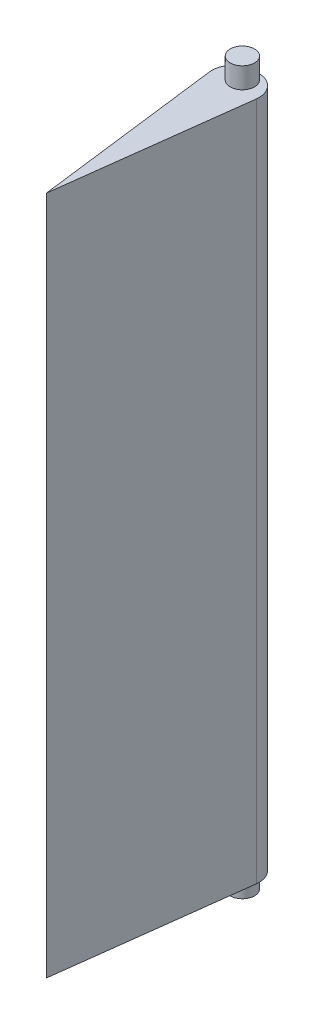
ISO-10303-21;
HEADER;
FILE_DESCRIPTION(('STEP AP214'),'2;1');
FILE_NAME('part.step','',(''),(''),'','','');
FILE_SCHEMA(('AUTOMOTIVE_DESIGN { 1 0 10303 214 1 1 1 1 }'));
ENDSEC;
DATA;
#1=APPLICATION_CONTEXT('core data for automotive mechanical design processes');
#2=APPLICATION_PROTOCOL_DEFINITION('international standard','automotive_design',2000,#1);
#3=PRODUCT_CONTEXT('',#1,'mechanical');
#4=PRODUCT('Part','Part','',(#3));
#5=PRODUCT_RELATED_PRODUCT_CATEGORY('part','',(#4));
#6=PRODUCT_DEFINITION_FORMATION('','',#4);
#7=PRODUCT_DEFINITION_CONTEXT('part definition',#1,'design');
#8=PRODUCT_DEFINITION('design','',#6,#7);
#9=PRODUCT_DEFINITION_SHAPE('','',#8);
#10=(LENGTH_UNIT() NAMED_UNIT(*) SI_UNIT(.MILLI.,.METRE.));
#11=(NAMED_UNIT(*) PLANE_ANGLE_UNIT() SI_UNIT($,.RADIAN.));
#12=(NAMED_UNIT(*) SI_UNIT($,.STERADIAN.) SOLID_ANGLE_UNIT());
#13=UNCERTAINTY_MEASURE_WITH_UNIT(LENGTH_MEASURE(1.E-05),#10,'distance_accuracy_value','');
#14=(GEOMETRIC_REPRESENTATION_CONTEXT(3) GLOBAL_UNCERTAINTY_ASSIGNED_CONTEXT((#13)) GLOBAL_UNIT_ASSIGNED_CONTEXT((#10,
#11,#12)) REPRESENTATION_CONTEXT('',''));
#15=CARTESIAN_POINT('',(0.,0.,0.));
#16=DIRECTION('',(0.,0.,1.));
#17=DIRECTION('',(1.,0.,0.));
#18=AXIS2_PLACEMENT_3D('',#15,#16,#17);
#19=CARTESIAN_POINT('',(0.,248.920000000001,0.));
#20=DIRECTION('',(0.992201999487507,0.,-0.12464025117529));
#21=DIRECTION('',(-0.12464025117529,0.,-0.992201999487507));
#22=AXIS2_PLACEMENT_3D('',#19,#20,#21);
#23=PLANE('',#22);
#24=DIRECTION('',(0.12464025117529,0.,0.992201999487507));
#25=VECTOR('',#24,1.);
#26=CARTESIAN_POINT('',(0.,248.920000000001,0.));
#27=LINE('',#26,#25);
#28=CARTESIAN_POINT('',(1.07653167315808,248.920000000001,8.56975871395546));
#29=VERTEX_POINT('',#28);
#30=CARTESIAN_POINT('',(9.65199999999999,248.920000000001,76.8350000000002));
#31=VERTEX_POINT('',#30);
#32=EDGE_CURVE('E94',#29,#31,#27,.T.);
#33=ORIENTED_EDGE('',*,*,#32,.F.);
#34=DIRECTION('',(0.,-1.,0.));
#35=VECTOR('',#34,1.);
#36=CARTESIAN_POINT('',(1.07653167315808,248.920000000001,8.56975871395546));
#37=LINE('',#36,#35);
#38=CARTESIAN_POINT('',(1.07653167315852,0.,8.56975871395546));
#39=VERTEX_POINT('',#38);
#40=EDGE_CURVE('E113',#29,#39,#37,.T.);
#41=ORIENTED_EDGE('',*,*,#40,.T.);
#42=DIRECTION('',(0.12464025117529,0.,0.992201999487507));
#43=VECTOR('',#42,1.);
#44=CARTESIAN_POINT('',(0.,0.,0.));
#45=LINE('',#44,#43);
#46=CARTESIAN_POINT('',(9.65200000000044,0.,76.8350000000004));
#47=VERTEX_POINT('',#46);
#48=EDGE_CURVE('E112',#39,#47,#45,.T.);
#49=ORIENTED_EDGE('',*,*,#48,.T.);
#50=DIRECTION('',(0.,-1.,0.));
#51=VECTOR('',#50,1.);
#52=CARTESIAN_POINT('',(9.65199999999999,248.920000000001,76.8350000000002));
#53=LINE('',#52,#51);
#54=EDGE_CURVE('E108',#31,#47,#53,.T.);
#55=ORIENTED_EDGE('',*,*,#54,.F.);
#56=EDGE_LOOP('',(#33,#41,#49,#55));
#57=FACE_BOUND('',#56,.T.);
#58=ADVANCED_FACE('F46',(#57),#23,.F.);
#59=CARTESIAN_POINT('',(9.65199999999999,248.920000000001,76.8350000000002));
#60=DIRECTION('',(-0.992201999487507,0.,-0.12464025117529));
#61=DIRECTION('',(-0.12464025117529,0.,0.992201999487507));
#62=AXIS2_PLACEMENT_3D('',#59,#60,#61);
#63=PLANE('',#62);
#64=DIRECTION('',(0.12464025117529,0.,-0.992201999487507));
#65=VECTOR('',#64,1.);
#66=CARTESIAN_POINT('',(9.65200000000044,0.,76.8350000000004));
#67=LINE('',#66,#65);
#68=CARTESIAN_POINT('',(18.2274683268424,0.,8.56975871395535));
#69=VERTEX_POINT('',#68);
#70=EDGE_CURVE('E187',#47,#69,#67,.T.);
#71=ORIENTED_EDGE('',*,*,#70,.T.);
#72=DIRECTION('',(0.,-1.,0.));
#73=VECTOR('',#72,1.);
#74=CARTESIAN_POINT('',(18.227468326842,248.920000000001,8.56975871395543));
#75=LINE('',#74,#73);
#76=CARTESIAN_POINT('',(18.227468326842,248.920000000001,8.56975871395546));
#77=VERTEX_POINT('',#76);
#78=EDGE_CURVE('E61',#69,#77,#75,.F.);
#79=ORIENTED_EDGE('',*,*,#78,.T.);
#80=DIRECTION('',(0.12464025117529,0.,-0.992201999487507));
#81=VECTOR('',#80,1.);
#82=CARTESIAN_POINT('',(9.65199999999999,248.920000000001,76.8350000000002));
#83=LINE('',#82,#81);
#84=EDGE_CURVE('E96',#31,#77,#83,.T.);
#85=ORIENTED_EDGE('',*,*,#84,.F.);
#86=ORIENTED_EDGE('',*,*,#54,.T.);
#87=EDGE_LOOP('',(#71,#79,#85,#86));
#88=FACE_BOUND('',#87,.T.);
#89=ADVANCED_FACE('F107',(#88),#63,.F.);
#90=CARTESIAN_POINT('',(0.,248.920000000001,0.));
#91=DIRECTION('',(0.,0.,1.00000000000002));
#92=DIRECTION('',(1.00000000000002,0.,0.));
#93=AXIS2_PLACEMENT_3D('',#90,#91,#92);
#94=PLANE('',#93);
#95=DIRECTION('',(-1.00000000000002,0.,0.));
#96=VECTOR('',#95,1.);
#97=CARTESIAN_POINT('',(0.,248.920000000001,0.));
#98=LINE('',#97,#96);
#99=CARTESIAN_POINT('',(10.6668890907482,248.920000000001,-2.22044604925031E-13));
#100=VERTEX_POINT('',#99);
#101=CARTESIAN_POINT('',(8.63711090925176,248.920000000001,-8.04911692853238E-13));
#102=VERTEX_POINT('',#101);
#103=EDGE_CURVE('E109',#100,#102,#98,.T.);
#104=ORIENTED_EDGE('',*,*,#103,.F.);
#105=DIRECTION('',(0.,-1.,0.));
#106=VECTOR('',#105,1.);
#107=CARTESIAN_POINT('',(10.6668890907482,248.920000000001,-2.22044604925031E-13));
#108=LINE('',#107,#106);
#109=CARTESIAN_POINT('',(10.6668890907479,0.,-1.19348975147204E-12));
#110=VERTEX_POINT('',#109);
#111=EDGE_CURVE('E127',#100,#110,#108,.T.);
#112=ORIENTED_EDGE('',*,*,#111,.T.);
#113=DIRECTION('',(-1.00000000000002,0.,0.));
#114=VECTOR('',#113,1.);
#115=CARTESIAN_POINT('',(0.,0.,0.));
#116=LINE('',#115,#114);
#117=CARTESIAN_POINT('',(8.6371109092514,0.,-1.16573417585641E-12));
#118=VERTEX_POINT('',#117);
#119=EDGE_CURVE('E104',#110,#118,#116,.T.);
#120=ORIENTED_EDGE('',*,*,#119,.T.);
#121=DIRECTION('',(0.,-1.,0.));
#122=VECTOR('',#121,1.);
#123=CARTESIAN_POINT('',(8.63711090925176,248.920000000001,-8.04911692853238E-13));
#124=LINE('',#123,#122);
#125=EDGE_CURVE('E123',#118,#102,#124,.F.);
#126=ORIENTED_EDGE('',*,*,#125,.T.);
#127=EDGE_LOOP('',(#104,#112,#120,#126));
#128=FACE_BOUND('',#127,.T.);
#129=ADVANCED_FACE('F135',(#128),#94,.F.);
#130=CARTESIAN_POINT('',(0.,248.920000000001,0.));
#131=DIRECTION('',(0.,1.,0.));
#132=DIRECTION('',(0.,0.,1.00000000000002));
#133=AXIS2_PLACEMENT_3D('',#130,#131,#132);
#134=PLANE('',#133);
#135=CARTESIAN_POINT('',(9.65199999999991,248.920000000001,5.08000000000211));
#136=DIRECTION('',(0.,1.,0.));
#137=DIRECTION('',(0.,0.,1.00000000000002));
#138=AXIS2_PLACEMENT_3D('',#135,#136,#137);
#139=CIRCLE('',#138,4.445);
#140=CARTESIAN_POINT('',(9.65199999999997,248.920000000001,0.635000000002028));
#141=VERTEX_POINT('',#140);
#142=EDGE_CURVE('E180',#141,#141,#139,.T.);
#143=ORIENTED_EDGE('',*,*,#142,.F.);
#144=EDGE_LOOP('',(#143));
#145=FACE_BOUND('',#144,.T.);
#146=ORIENTED_EDGE('',*,*,#84,.T.);
#147=CARTESIAN_POINT('',(10.6668890907478,248.920000000001,7.62000000000204));
#148=DIRECTION('',(0.,1.,0.));
#149=DIRECTION('',(0.,0.,1.00000000000002));
#150=AXIS2_PLACEMENT_3D('',#147,#148,#149);
#151=CIRCLE('',#150,7.62);
#152=EDGE_CURVE('E54',#77,#100,#151,.T.);
#153=ORIENTED_EDGE('',*,*,#152,.T.);
#154=ORIENTED_EDGE('',*,*,#103,.T.);
#155=CARTESIAN_POINT('',(8.63711090925218,248.920000000001,7.62000000000154));
#156=DIRECTION('',(0.,1.,0.));
#157=DIRECTION('',(0.,0.,1.00000000000002));
#158=AXIS2_PLACEMENT_3D('',#155,#156,#157);
#159=CIRCLE('',#158,7.62);
#160=EDGE_CURVE('E99',#102,#29,#159,.T.);
#161=ORIENTED_EDGE('',*,*,#160,.T.);
#162=ORIENTED_EDGE('',*,*,#32,.T.);
#163=EDGE_LOOP('',(#146,#153,#154,#161,#162));
#164=FACE_BOUND('',#163,.T.);
#165=ADVANCED_FACE('F95',(#145,#164),#134,.T.);
#166=CARTESIAN_POINT('',(0.,0.,0.));
#167=DIRECTION('',(0.,1.,0.));
#168=DIRECTION('',(0.,0.,1.00000000000002));
#169=AXIS2_PLACEMENT_3D('',#166,#167,#168);
#170=PLANE('',#169);
#171=CARTESIAN_POINT('',(9.65200000000041,0.,5.07999999999978));
#172=DIRECTION('',(0.,1.,0.));
#173=DIRECTION('',(0.,0.,1.00000000000002));
#174=AXIS2_PLACEMENT_3D('',#171,#172,#173);
#175=CIRCLE('',#174,4.445);
#176=CARTESIAN_POINT('',(9.65200000000041,0.,9.52499999999986));
#177=VERTEX_POINT('',#176);
#178=EDGE_CURVE('E13',#177,#177,#175,.F.);
#179=ORIENTED_EDGE('',*,*,#178,.F.);
#180=EDGE_LOOP('',(#179));
#181=FACE_BOUND('',#180,.T.);
#182=ORIENTED_EDGE('',*,*,#119,.F.);
#183=CARTESIAN_POINT('',(10.6668890907473,0.,7.62000000000096));
#184=DIRECTION('',(0.,1.,0.));
#185=DIRECTION('',(0.,0.,1.00000000000002));
#186=AXIS2_PLACEMENT_3D('',#183,#184,#185);
#187=CIRCLE('',#186,7.62);
#188=EDGE_CURVE('E69',#110,#69,#187,.F.);
#189=ORIENTED_EDGE('',*,*,#188,.T.);
#190=ORIENTED_EDGE('',*,*,#70,.F.);
#191=ORIENTED_EDGE('',*,*,#48,.F.);
#192=CARTESIAN_POINT('',(8.63711090925245,0.,7.62000000000093));
#193=DIRECTION('',(0.,1.,0.));
#194=DIRECTION('',(0.,0.,1.00000000000002));
#195=AXIS2_PLACEMENT_3D('',#192,#193,#194);
#196=CIRCLE('',#195,7.62);
#197=EDGE_CURVE('E115',#39,#118,#196,.F.);
#198=ORIENTED_EDGE('',*,*,#197,.T.);
#199=EDGE_LOOP('',(#182,#189,#190,#191,#198));
#200=FACE_BOUND('',#199,.T.);
#201=ADVANCED_FACE('F147',(#181,#200),#170,.F.);
#202=CARTESIAN_POINT('',(8.63711090925218,248.920000000001,7.62000000000154));
#203=DIRECTION('',(0.,-1.,0.));
#204=DIRECTION('',(0.,0.,-1.00000000000002));
#205=AXIS2_PLACEMENT_3D('',#202,#203,#204);
#206=CYLINDRICAL_SURFACE('',#205,7.62);
#207=ORIENTED_EDGE('',*,*,#160,.F.);
#208=ORIENTED_EDGE('',*,*,#125,.F.);
#209=ORIENTED_EDGE('',*,*,#197,.F.);
#210=ORIENTED_EDGE('',*,*,#40,.F.);
#211=EDGE_LOOP('',(#207,#208,#209,#210));
#212=FACE_BOUND('',#211,.T.);
#213=ADVANCED_FACE('F139',(#212),#206,.T.);
#214=CARTESIAN_POINT('',(10.6668890907478,248.920000000001,7.62000000000204));
#215=DIRECTION('',(0.,-1.,0.));
#216=DIRECTION('',(0.,0.,-1.00000000000002));
#217=AXIS2_PLACEMENT_3D('',#214,#215,#216);
#218=CYLINDRICAL_SURFACE('',#217,7.62);
#219=ORIENTED_EDGE('',*,*,#152,.F.);
#220=ORIENTED_EDGE('',*,*,#78,.F.);
#221=ORIENTED_EDGE('',*,*,#188,.F.);
#222=ORIENTED_EDGE('',*,*,#111,.F.);
#223=EDGE_LOOP('',(#219,#220,#221,#222));
#224=FACE_BOUND('',#223,.T.);
#225=ADVANCED_FACE('F48',(#224),#218,.T.);
#226=CARTESIAN_POINT('',(9.65200000000041,-7.61999999999996,5.07999999999978));
#227=DIRECTION('',(0.,1.,0.));
#228=DIRECTION('',(0.,0.,1.00000000000002));
#229=AXIS2_PLACEMENT_3D('',#226,#227,#228);
#230=CYLINDRICAL_SURFACE('',#229,4.445);
#231=CARTESIAN_POINT('',(9.65200000000041,-7.61999999999996,5.07999999999978));
#232=DIRECTION('',(0.,-1.,0.));
#233=DIRECTION('',(0.,0.,-1.00000000000002));
#234=AXIS2_PLACEMENT_3D('',#231,#232,#233);
#235=CIRCLE('',#234,4.445);
#236=CARTESIAN_POINT('',(9.65200000000041,-7.61999999999996,9.52499999999986));
#237=VERTEX_POINT('',#236);
#238=EDGE_CURVE('E179',#237,#237,#235,.T.);
#239=CARTESIAN_POINT('',(9.65200000000041,-7.61999999999996,9.52499999999986));
#240=CARTESIAN_POINT('',(9.65200000000041,-7.54062499999996,9.52499999999986));
#241=CARTESIAN_POINT('',(9.65200000000041,-7.46124999999996,9.52499999999986));
#242=CARTESIAN_POINT('',(9.65200000000041,-7.30249999999996,9.52499999999986));
#243=CARTESIAN_POINT('',(9.65200000000041,-7.22312499999996,9.52499999999986));
#244=CARTESIAN_POINT('',(9.65200000000041,-7.06437499999996,9.52499999999986));
#245=CARTESIAN_POINT('',(9.65200000000041,-6.98499999999996,9.52499999999986));
#246=CARTESIAN_POINT('',(9.65200000000041,-6.82624999999996,9.52499999999986));
#247=CARTESIAN_POINT('',(9.65200000000041,-6.74687499999996,9.52499999999986));
#248=CARTESIAN_POINT('',(9.65200000000041,-6.58812499999997,9.52499999999986));
#249=CARTESIAN_POINT('',(9.65200000000041,-6.50874999999997,9.52499999999986));
#250=CARTESIAN_POINT('',(9.65200000000041,-6.34999999999997,9.52499999999986));
#251=CARTESIAN_POINT('',(9.65200000000041,-6.27062499999997,9.52499999999986));
#252=CARTESIAN_POINT('',(9.65200000000041,-6.11187499999997,9.52499999999986));
#253=CARTESIAN_POINT('',(9.65200000000041,-6.03249999999997,9.52499999999986));
#254=CARTESIAN_POINT('',(9.65200000000041,-5.87374999999997,9.52499999999986));
#255=CARTESIAN_POINT('',(9.65200000000041,-5.79437499999997,9.52499999999986));
#256=CARTESIAN_POINT('',(9.65200000000041,-5.63562499999997,9.52499999999986));
#257=CARTESIAN_POINT('',(9.65200000000041,-5.55624999999997,9.52499999999986));
#258=CARTESIAN_POINT('',(9.65200000000041,-5.39749999999997,9.52499999999986));
#259=CARTESIAN_POINT('',(9.65200000000041,-5.31812499999997,9.52499999999986));
#260=CARTESIAN_POINT('',(9.65200000000041,-5.15937499999997,9.52499999999986));
#261=CARTESIAN_POINT('',(9.65200000000041,-5.07999999999997,9.52499999999986));
#262=CARTESIAN_POINT('',(9.65200000000041,-4.92124999999997,9.52499999999986));
#263=CARTESIAN_POINT('',(9.65200000000041,-4.84187499999998,9.52499999999986));
#264=CARTESIAN_POINT('',(9.65200000000041,-4.68312499999998,9.52499999999986));
#265=CARTESIAN_POINT('',(9.65200000000041,-4.60374999999998,9.52499999999986));
#266=CARTESIAN_POINT('',(9.65200000000041,-4.44499999999998,9.52499999999986));
#267=CARTESIAN_POINT('',(9.65200000000041,-4.36562499999998,9.52499999999986));
#268=CARTESIAN_POINT('',(9.65200000000041,-4.20687499999998,9.52499999999986));
#269=CARTESIAN_POINT('',(9.65200000000041,-4.12749999999998,9.52499999999986));
#270=CARTESIAN_POINT('',(9.65200000000041,-3.96874999999998,9.52499999999986));
#271=CARTESIAN_POINT('',(9.65200000000041,-3.88937499999998,9.52499999999986));
#272=CARTESIAN_POINT('',(9.65200000000041,-3.73062499999998,9.52499999999986));
#273=CARTESIAN_POINT('',(9.65200000000041,-3.65124999999998,9.52499999999986));
#274=CARTESIAN_POINT('',(9.65200000000041,-3.49249999999998,9.52499999999986));
#275=CARTESIAN_POINT('',(9.65200000000041,-3.41312499999998,9.52499999999986));
#276=CARTESIAN_POINT('',(9.65200000000041,-3.25437499999998,9.52499999999986));
#277=CARTESIAN_POINT('',(9.65200000000041,-3.17499999999998,9.52499999999986));
#278=CARTESIAN_POINT('',(9.65200000000041,-3.01624999999999,9.52499999999986));
#279=CARTESIAN_POINT('',(9.65200000000041,-2.93687499999999,9.52499999999986));
#280=CARTESIAN_POINT('',(9.65200000000041,-2.77812499999999,9.52499999999986));
#281=CARTESIAN_POINT('',(9.65200000000041,-2.69874999999999,9.52499999999986));
#282=CARTESIAN_POINT('',(9.65200000000041,-2.53999999999999,9.52499999999986));
#283=CARTESIAN_POINT('',(9.65200000000041,-2.46062499999999,9.52499999999986));
#284=CARTESIAN_POINT('',(9.65200000000041,-2.30187499999999,9.52499999999986));
#285=CARTESIAN_POINT('',(9.65200000000041,-2.22249999999999,9.52499999999986));
#286=CARTESIAN_POINT('',(9.65200000000041,-2.06374999999999,9.52499999999986));
#287=CARTESIAN_POINT('',(9.65200000000041,-1.98437499999999,9.52499999999986));
#288=CARTESIAN_POINT('',(9.65200000000041,-1.82562499999999,9.52499999999986));
#289=CARTESIAN_POINT('',(9.65200000000041,-1.74624999999999,9.52499999999986));
#290=CARTESIAN_POINT('',(9.65200000000041,-1.58749999999999,9.52499999999986));
#291=CARTESIAN_POINT('',(9.65200000000041,-1.50812499999999,9.52499999999986));
#292=CARTESIAN_POINT('',(9.65200000000041,-1.34937499999999,9.52499999999986));
#293=CARTESIAN_POINT('',(9.65200000000041,-1.26999999999999,9.52499999999986));
#294=CARTESIAN_POINT('',(9.65200000000041,-1.11124999999999,9.52499999999986));
#295=CARTESIAN_POINT('',(9.65200000000041,-1.031875,9.52499999999986));
#296=CARTESIAN_POINT('',(9.65200000000041,-0.873124999999996,9.52499999999986));
#297=CARTESIAN_POINT('',(9.65200000000041,-0.793749999999997,9.52499999999986));
#298=CARTESIAN_POINT('',(9.65200000000041,-0.634999999999998,9.52499999999986));
#299=CARTESIAN_POINT('',(9.65200000000041,-0.555624999999998,9.52499999999986));
#300=CARTESIAN_POINT('',(9.65200000000041,-0.396874999999999,9.52499999999986));
#301=CARTESIAN_POINT('',(9.65200000000041,-0.317499999999999,9.52499999999986));
#302=CARTESIAN_POINT('',(9.65200000000041,-0.15875,9.52499999999986));
#303=CARTESIAN_POINT('',(9.65200000000041,-0.0793750000000004,9.52499999999986));
#304=CARTESIAN_POINT('',(9.65200000000041,0.,9.52499999999986));
#305=B_SPLINE_CURVE_WITH_KNOTS('',3,(#239,#240,#241,#242,#243,#244,#245,#246,#247,#248,#249,
#250,#251,#252,#253,#254,#255,#256,#257,#258,#259,#260,#261,#262,#263,#264,#265,#266,#267,#268,
#269,#270,#271,#272,#273,#274,#275,#276,#277,#278,#279,#280,#281,#282,#283,#284,#285,#286,#287,
#288,#289,#290,#291,#292,#293,#294,#295,#296,#297,#298,#299,#300,#301,#302,#303,#304),
.UNSPECIFIED.,.F.,.F.,(4,2,2,2,2,2,2,2,2,2,2,2,2,2,2,2,2,2,2,2,2,2,2,2,2,2,2,2,2,2,2,2,4),(0.,
0.238125,0.476249999999998,0.714374999999997,0.952499999999996,1.19062499999999,
1.42874999999999,1.66687499999999,1.90499999999999,2.14312499999999,2.38124999999999,
2.61937499999999,2.85749999999999,3.09562499999998,3.33374999999998,3.57187499999998,
3.80999999999998,4.04812499999998,4.28624999999998,4.52437499999998,4.76249999999998,
5.00062499999997,5.23874999999997,5.47687499999997,5.71499999999997,5.95312499999997,
6.19124999999997,6.42937499999997,6.66749999999996,6.90562499999996,7.14374999999996,
7.38187499999996,7.61999999999996),.UNSPECIFIED.);
#306=EDGE_CURVE('BSEAM138',#237,#177,#305,.T.);
#307=ORIENTED_EDGE('',*,*,#238,.F.);
#308=ORIENTED_EDGE('',*,*,#178,.T.);
#309=ORIENTED_EDGE('',*,*,#306,.T.);
#310=ORIENTED_EDGE('',*,*,#306,.F.);
#311=EDGE_LOOP('',(#307,#309,#308,#310));
#312=FACE_BOUND('',#311,.T.);
#313=ADVANCED_FACE('F138',(#312),#230,.T.);
#314=CARTESIAN_POINT('',(9.65200000000041,-7.61999999999996,5.07999999999978));
#315=DIRECTION('',(0.,-1.,0.));
#316=DIRECTION('',(0.,0.,-1.00000000000002));
#317=AXIS2_PLACEMENT_3D('',#314,#315,#316);
#318=PLANE('',#317);
#319=ORIENTED_EDGE('',*,*,#238,.T.);
#320=EDGE_LOOP('',(#319));
#321=FACE_BOUND('',#320,.T.);
#322=ADVANCED_FACE('F144',(#321),#318,.T.);
#323=CARTESIAN_POINT('',(9.65199999999997,256.540000000001,5.08000000000211));
#324=DIRECTION('',(0.,-1.,0.));
#325=DIRECTION('',(0.,0.,-1.00000000000002));
#326=AXIS2_PLACEMENT_3D('',#323,#324,#325);
#327=CYLINDRICAL_SURFACE('',#326,4.445);
#328=CARTESIAN_POINT('',(9.65199999999997,256.540000000001,5.08000000000211));
#329=DIRECTION('',(0.,1.,0.));
#330=DIRECTION('',(0.,0.,1.00000000000002));
#331=AXIS2_PLACEMENT_3D('',#328,#329,#330);
#332=CIRCLE('',#331,4.445);
#333=CARTESIAN_POINT('',(9.65199999999997,256.540000000001,0.635000000002028));
#334=VERTEX_POINT('',#333);
#335=EDGE_CURVE('E178',#334,#334,#332,.T.);
#336=CARTESIAN_POINT('',(9.65199999999997,256.540000000001,0.635000000002028));
#337=CARTESIAN_POINT('',(9.65199999999997,256.460625000001,0.635000000002028));
#338=CARTESIAN_POINT('',(9.65199999999997,256.381250000001,0.635000000002028));
#339=CARTESIAN_POINT('',(9.65199999999997,256.222500000001,0.635000000002028));
#340=CARTESIAN_POINT('',(9.65199999999997,256.143125000001,0.635000000002028));
#341=CARTESIAN_POINT('',(9.65199999999997,255.984375000001,0.635000000002028));
#342=CARTESIAN_POINT('',(9.65199999999997,255.905000000001,0.635000000002028));
#343=CARTESIAN_POINT('',(9.65199999999997,255.746250000001,0.635000000002028));
#344=CARTESIAN_POINT('',(9.65199999999997,255.666875000001,0.635000000002028));
#345=CARTESIAN_POINT('',(9.65199999999997,255.508125000001,0.635000000002028));
#346=CARTESIAN_POINT('',(9.65199999999997,255.428750000001,0.635000000002028));
#347=CARTESIAN_POINT('',(9.65199999999997,255.270000000001,0.635000000002028));
#348=CARTESIAN_POINT('',(9.65199999999997,255.190625000001,0.635000000002028));
#349=CARTESIAN_POINT('',(9.65199999999997,255.031875000001,0.635000000002028));
#350=CARTESIAN_POINT('',(9.65199999999997,254.952500000001,0.635000000002028));
#351=CARTESIAN_POINT('',(9.65199999999997,254.793750000001,0.635000000002028));
#352=CARTESIAN_POINT('',(9.65199999999997,254.714375000001,0.635000000002028));
#353=CARTESIAN_POINT('',(9.65199999999997,254.555625000001,0.635000000002028));
#354=CARTESIAN_POINT('',(9.65199999999997,254.476250000001,0.635000000002028));
#355=CARTESIAN_POINT('',(9.65199999999997,254.317500000001,0.635000000002028));
#356=CARTESIAN_POINT('',(9.65199999999997,254.238125000001,0.635000000002028));
#357=CARTESIAN_POINT('',(9.65199999999997,254.079375000001,0.635000000002028));
#358=CARTESIAN_POINT('',(9.65199999999997,254.000000000001,0.635000000002028));
#359=CARTESIAN_POINT('',(9.65199999999997,253.841250000001,0.635000000002028));
#360=CARTESIAN_POINT('',(9.65199999999997,253.761875000001,0.635000000002028));
#361=CARTESIAN_POINT('',(9.65199999999997,253.603125000001,0.635000000002028));
#362=CARTESIAN_POINT('',(9.65199999999997,253.523750000001,0.635000000002028));
#363=CARTESIAN_POINT('',(9.65199999999997,253.365000000001,0.635000000002028));
#364=CARTESIAN_POINT('',(9.65199999999997,253.285625000001,0.635000000002028));
#365=CARTESIAN_POINT('',(9.65199999999997,253.126875000001,0.635000000002028));
#366=CARTESIAN_POINT('',(9.65199999999997,253.047500000001,0.635000000002028));
#367=CARTESIAN_POINT('',(9.65199999999997,252.888750000001,0.635000000002028));
#368=CARTESIAN_POINT('',(9.65199999999997,252.809375000001,0.635000000002028));
#369=CARTESIAN_POINT('',(9.65199999999997,252.650625000001,0.635000000002028));
#370=CARTESIAN_POINT('',(9.65199999999997,252.571250000001,0.635000000002028));
#371=CARTESIAN_POINT('',(9.65199999999997,252.412500000001,0.635000000002028));
#372=CARTESIAN_POINT('',(9.65199999999997,252.333125000001,0.635000000002028));
#373=CARTESIAN_POINT('',(9.65199999999997,252.174375000001,0.635000000002028));
#374=CARTESIAN_POINT('',(9.65199999999997,252.095000000001,0.635000000002028));
#375=CARTESIAN_POINT('',(9.65199999999997,251.936250000001,0.635000000002028));
#376=CARTESIAN_POINT('',(9.65199999999997,251.856875000001,0.635000000002028));
#377=CARTESIAN_POINT('',(9.65199999999997,251.698125000001,0.635000000002028));
#378=CARTESIAN_POINT('',(9.65199999999997,251.618750000001,0.635000000002028));
#379=CARTESIAN_POINT('',(9.65199999999997,251.460000000001,0.635000000002028));
#380=CARTESIAN_POINT('',(9.65199999999997,251.380625000001,0.635000000002028));
#381=CARTESIAN_POINT('',(9.65199999999997,251.221875000001,0.635000000002028));
#382=CARTESIAN_POINT('',(9.65199999999997,251.142500000001,0.635000000002028));
#383=CARTESIAN_POINT('',(9.65199999999997,250.983750000001,0.635000000002028));
#384=CARTESIAN_POINT('',(9.65199999999997,250.904375000001,0.635000000002028));
#385=CARTESIAN_POINT('',(9.65199999999997,250.745625000001,0.635000000002028));
#386=CARTESIAN_POINT('',(9.65199999999997,250.666250000001,0.635000000002028));
#387=CARTESIAN_POINT('',(9.65199999999997,250.507500000001,0.635000000002028));
#388=CARTESIAN_POINT('',(9.65199999999997,250.428125000001,0.635000000002028));
#389=CARTESIAN_POINT('',(9.65199999999997,250.269375000001,0.635000000002028));
#390=CARTESIAN_POINT('',(9.65199999999997,250.190000000001,0.635000000002028));
#391=CARTESIAN_POINT('',(9.65199999999997,250.031250000001,0.635000000002028));
#392=CARTESIAN_POINT('',(9.65199999999997,249.951875000001,0.635000000002028));
#393=CARTESIAN_POINT('',(9.65199999999997,249.793125000001,0.635000000002028));
#394=CARTESIAN_POINT('',(9.65199999999997,249.713750000001,0.635000000002028));
#395=CARTESIAN_POINT('',(9.65199999999997,249.555000000001,0.635000000002028));
#396=CARTESIAN_POINT('',(9.65199999999997,249.475625000001,0.635000000002028));
#397=CARTESIAN_POINT('',(9.65199999999997,249.316875000001,0.635000000002028));
#398=CARTESIAN_POINT('',(9.65199999999997,249.237500000001,0.635000000002028));
#399=CARTESIAN_POINT('',(9.65199999999997,249.078750000001,0.635000000002028));
#400=CARTESIAN_POINT('',(9.65199999999997,248.999375000001,0.635000000002028));
#401=CARTESIAN_POINT('',(9.65199999999997,248.920000000001,0.635000000002028));
#402=B_SPLINE_CURVE_WITH_KNOTS('',3,(#336,#337,#338,#339,#340,#341,#342,#343,#344,#345,#346,
#347,#348,#349,#350,#351,#352,#353,#354,#355,#356,#357,#358,#359,#360,#361,#362,#363,#364,#365,
#366,#367,#368,#369,#370,#371,#372,#373,#374,#375,#376,#377,#378,#379,#380,#381,#382,#383,#384,
#385,#386,#387,#388,#389,#390,#391,#392,#393,#394,#395,#396,#397,#398,#399,#400,#401),
.UNSPECIFIED.,.F.,.F.,(4,2,2,2,2,2,2,2,2,2,2,2,2,2,2,2,2,2,2,2,2,2,2,2,2,2,2,2,2,2,2,2,4),(0.,
0.238124999999978,0.476249999999956,0.714374999999989,0.952499999999967,1.19062499999995,
1.42874999999998,1.66687499999996,1.90499999999999,2.14312499999997,2.38124999999995,
2.61937499999998,2.85749999999996,3.09562499999994,3.33374999999997,3.57187499999995,
3.80999999999998,4.04812499999996,4.28624999999994,4.52437499999997,4.76249999999995,
5.00062499999998,5.23874999999996,5.47687499999994,5.71499999999997,5.95312499999995,
6.19124999999993,6.42937499999996,6.66749999999994,6.90562499999994,7.14374999999995,
7.38187499999995,7.61999999999993),.UNSPECIFIED.);
#403=EDGE_CURVE('BSEAM166',#334,#141,#402,.T.);
#404=ORIENTED_EDGE('',*,*,#335,.F.);
#405=ORIENTED_EDGE('',*,*,#142,.T.);
#406=ORIENTED_EDGE('',*,*,#403,.T.);
#407=ORIENTED_EDGE('',*,*,#403,.F.);
#408=EDGE_LOOP('',(#404,#406,#405,#407));
#409=FACE_BOUND('',#408,.T.);
#410=ADVANCED_FACE('F166',(#409),#327,.T.);
#411=CARTESIAN_POINT('',(9.65199999999997,256.540000000001,5.08000000000211));
#412=DIRECTION('',(0.,1.,0.));
#413=DIRECTION('',(0.,0.,1.00000000000002));
#414=AXIS2_PLACEMENT_3D('',#411,#412,#413);
#415=PLANE('',#414);
#416=ORIENTED_EDGE('',*,*,#335,.T.);
#417=EDGE_LOOP('',(#416));
#418=FACE_BOUND('',#417,.T.);
#419=ADVANCED_FACE('F170',(#418),#415,.T.);
#420=CLOSED_SHELL('',(#58,#89,#129,#165,#201,#213,#225,#313,#322,#410,#419));
#421=MANIFOLD_SOLID_BREP('B2',#420);
#422=ADVANCED_BREP_SHAPE_REPRESENTATION('',(#18,#421),#14);
#423=SHAPE_DEFINITION_REPRESENTATION(#9,#422);
ENDSEC;
END-ISO-10303-21;
